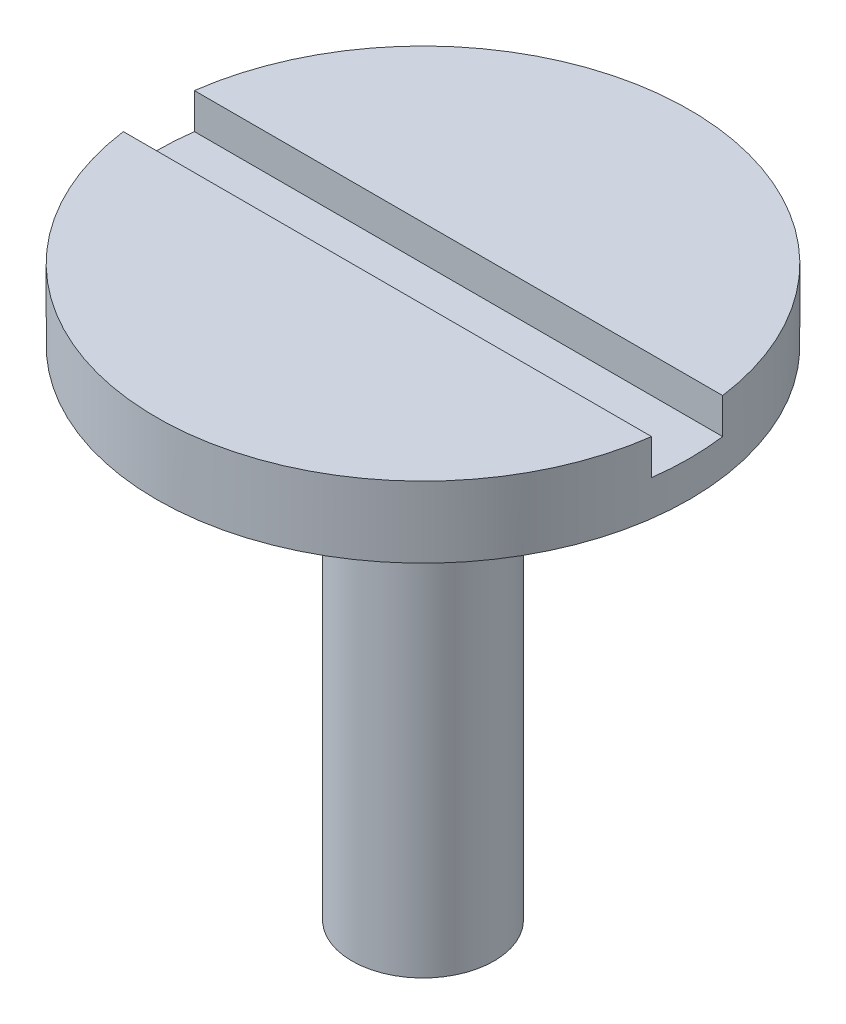
ISO-10303-21;
HEADER;
FILE_DESCRIPTION(('STEP AP214'),'2;1');
FILE_NAME('part.step','',(''),(''),'','','');
FILE_SCHEMA(('AUTOMOTIVE_DESIGN { 1 0 10303 214 1 1 1 1 }'));
ENDSEC;
DATA;
#1=APPLICATION_CONTEXT('core data for automotive mechanical design processes');
#2=APPLICATION_PROTOCOL_DEFINITION('international standard','automotive_design',2000,#1);
#3=PRODUCT_CONTEXT('',#1,'mechanical');
#4=PRODUCT('Part','Part','',(#3));
#5=PRODUCT_RELATED_PRODUCT_CATEGORY('part','',(#4));
#6=PRODUCT_DEFINITION_FORMATION('','',#4);
#7=PRODUCT_DEFINITION_CONTEXT('part definition',#1,'design');
#8=PRODUCT_DEFINITION('design','',#6,#7);
#9=PRODUCT_DEFINITION_SHAPE('','',#8);
#10=(LENGTH_UNIT() NAMED_UNIT(*) SI_UNIT(.MILLI.,.METRE.));
#11=(NAMED_UNIT(*) PLANE_ANGLE_UNIT() SI_UNIT($,.RADIAN.));
#12=(NAMED_UNIT(*) SI_UNIT($,.STERADIAN.) SOLID_ANGLE_UNIT());
#13=UNCERTAINTY_MEASURE_WITH_UNIT(LENGTH_MEASURE(1.E-05),#10,'distance_accuracy_value','');
#14=(GEOMETRIC_REPRESENTATION_CONTEXT(3) GLOBAL_UNCERTAINTY_ASSIGNED_CONTEXT((#13)) GLOBAL_UNIT_ASSIGNED_CONTEXT((#10,
#11,#12)) REPRESENTATION_CONTEXT('',''));
#15=CARTESIAN_POINT('',(0.,0.,0.));
#16=DIRECTION('',(0.,0.,1.));
#17=DIRECTION('',(1.,0.,0.));
#18=AXIS2_PLACEMENT_3D('',#15,#16,#17);
#19=CARTESIAN_POINT('',(0.,8.,0.));
#20=DIRECTION('',(0.,1.,0.));
#21=DIRECTION('',(0.,0.,1.));
#22=AXIS2_PLACEMENT_3D('',#19,#20,#21);
#23=PLANE('',#22);
#24=DIRECTION('',(-1.,0.,0.));
#25=VECTOR('',#24,1.);
#26=CARTESIAN_POINT('',(0.,8.,-0.5));
#27=LINE('',#26,#25);
#28=CARTESIAN_POINT('',(3.71651718682963,8.,-0.5));
#29=VERTEX_POINT('',#28);
#30=CARTESIAN_POINT('',(-3.71651718682963,8.,-0.5));
#31=VERTEX_POINT('',#30);
#32=EDGE_CURVE('E80',#29,#31,#27,.T.);
#33=ORIENTED_EDGE('',*,*,#32,.F.);
#34=CARTESIAN_POINT('',(0.,8.,0.));
#35=DIRECTION('',(0.,1.,0.));
#36=DIRECTION('',(0.,0.,1.));
#37=AXIS2_PLACEMENT_3D('',#34,#35,#36);
#38=CIRCLE('',#37,3.75);
#39=EDGE_CURVE('E93',#29,#31,#38,.T.);
#40=ORIENTED_EDGE('',*,*,#39,.T.);
#41=EDGE_LOOP('',(#33,#40));
#42=FACE_BOUND('',#41,.T.);
#43=ADVANCED_FACE('F33',(#42),#23,.T.);
#44=CARTESIAN_POINT('',(0.,7.,0.));
#45=DIRECTION('',(0.,-1.,0.));
#46=DIRECTION('',(0.,0.,-1.));
#47=AXIS2_PLACEMENT_3D('',#44,#45,#46);
#48=CYLINDRICAL_SURFACE('',#47,1.);
#49=CARTESIAN_POINT('',(0.,7.,0.));
#50=DIRECTION('',(0.,1.,0.));
#51=DIRECTION('',(0.,0.,1.));
#52=AXIS2_PLACEMENT_3D('',#49,#50,#51);
#53=CIRCLE('',#52,1.);
#54=CARTESIAN_POINT('',(0.,7.,1.));
#55=VERTEX_POINT('',#54);
#56=EDGE_CURVE('E81',#55,#55,#53,.T.);
#57=ORIENTED_EDGE('',*,*,#56,.F.);
#58=EDGE_LOOP('',(#57));
#59=FACE_BOUND('',#58,.T.);
#60=CARTESIAN_POINT('',(0.,0.,0.));
#61=DIRECTION('',(0.,1.,0.));
#62=DIRECTION('',(0.,0.,1.));
#63=AXIS2_PLACEMENT_3D('',#60,#61,#62);
#64=CIRCLE('',#63,1.);
#65=CARTESIAN_POINT('',(0.,0.,1.));
#66=VERTEX_POINT('',#65);
#67=EDGE_CURVE('E97',#66,#66,#64,.T.);
#68=ORIENTED_EDGE('',*,*,#67,.T.);
#69=EDGE_LOOP('',(#68));
#70=FACE_BOUND('',#69,.T.);
#71=ADVANCED_FACE('F35',(#59,#70),#48,.T.);
#72=CARTESIAN_POINT('',(0.,0.,0.));
#73=DIRECTION('',(0.,1.,0.));
#74=DIRECTION('',(0.,0.,1.));
#75=AXIS2_PLACEMENT_3D('',#72,#73,#74);
#76=PLANE('',#75);
#77=ORIENTED_EDGE('',*,*,#67,.F.);
#78=EDGE_LOOP('',(#77));
#79=FACE_BOUND('',#78,.T.);
#80=ADVANCED_FACE('F122',(#79),#76,.F.);
#81=CARTESIAN_POINT('',(0.,7.,0.));
#82=DIRECTION('',(0.,1.,0.));
#83=DIRECTION('',(0.,0.,1.));
#84=AXIS2_PLACEMENT_3D('',#81,#82,#83);
#85=PLANE('',#84);
#86=CARTESIAN_POINT('',(0.,7.,0.));
#87=DIRECTION('',(0.,1.,0.));
#88=DIRECTION('',(0.,0.,1.));
#89=AXIS2_PLACEMENT_3D('',#86,#87,#88);
#90=CIRCLE('',#89,3.75);
#91=CARTESIAN_POINT('',(0.,7.,3.75));
#92=VERTEX_POINT('',#91);
#93=EDGE_CURVE('E94',#92,#92,#90,.T.);
#94=ORIENTED_EDGE('',*,*,#93,.F.);
#95=EDGE_LOOP('',(#94));
#96=FACE_BOUND('',#95,.T.);
#97=ORIENTED_EDGE('',*,*,#56,.T.);
#98=EDGE_LOOP('',(#97));
#99=FACE_BOUND('',#98,.T.);
#100=ADVANCED_FACE('F132',(#96,#99),#85,.F.);
#101=CARTESIAN_POINT('',(0.,8.,0.));
#102=DIRECTION('',(0.,-1.,0.));
#103=DIRECTION('',(0.,0.,-1.));
#104=AXIS2_PLACEMENT_3D('',#101,#102,#103);
#105=CYLINDRICAL_SURFACE('',#104,3.75);
#106=ORIENTED_EDGE('',*,*,#39,.F.);
#107=DIRECTION('',(0.,-1.,0.));
#108=VECTOR('',#107,1.);
#109=CARTESIAN_POINT('',(3.71651718682963,8.,-0.5));
#110=LINE('',#109,#108);
#111=CARTESIAN_POINT('',(3.71651718682963,7.5,-0.5));
#112=VERTEX_POINT('',#111);
#113=EDGE_CURVE('E99',#29,#112,#110,.T.);
#114=ORIENTED_EDGE('',*,*,#113,.T.);
#115=CARTESIAN_POINT('',(0.,7.5,0.));
#116=DIRECTION('',(0.,1.,0.));
#117=DIRECTION('',(0.,0.,1.));
#118=AXIS2_PLACEMENT_3D('',#115,#116,#117);
#119=CIRCLE('',#118,3.75);
#120=CARTESIAN_POINT('',(3.71651718682963,7.5,0.5));
#121=VERTEX_POINT('',#120);
#122=EDGE_CURVE('E11',#121,#112,#119,.T.);
#123=ORIENTED_EDGE('',*,*,#122,.F.);
#124=DIRECTION('',(0.,-1.,0.));
#125=VECTOR('',#124,1.);
#126=CARTESIAN_POINT('',(3.71651718682963,8.,0.5));
#127=LINE('',#126,#125);
#128=CARTESIAN_POINT('',(3.71651718682963,8.,0.5));
#129=VERTEX_POINT('',#128);
#130=EDGE_CURVE('E75',#121,#129,#127,.F.);
#131=ORIENTED_EDGE('',*,*,#130,.T.);
#132=CARTESIAN_POINT('',(-3.71651718682963,8.,0.5));
#133=VERTEX_POINT('',#132);
#134=EDGE_CURVE('E88',#133,#129,#38,.T.);
#135=ORIENTED_EDGE('',*,*,#134,.F.);
#136=DIRECTION('',(0.,-1.,0.));
#137=VECTOR('',#136,1.);
#138=CARTESIAN_POINT('',(-3.71651718682963,8.,0.5));
#139=LINE('',#138,#137);
#140=CARTESIAN_POINT('',(-3.71651718682963,7.5,0.5));
#141=VERTEX_POINT('',#140);
#142=EDGE_CURVE('E48',#133,#141,#139,.T.);
#143=ORIENTED_EDGE('',*,*,#142,.T.);
#144=CARTESIAN_POINT('',(-3.71651718682963,7.5,-0.5));
#145=VERTEX_POINT('',#144);
#146=EDGE_CURVE('E37',#145,#141,#119,.T.);
#147=ORIENTED_EDGE('',*,*,#146,.F.);
#148=DIRECTION('',(0.,-1.,0.));
#149=VECTOR('',#148,1.);
#150=CARTESIAN_POINT('',(-3.71651718682963,8.,-0.5));
#151=LINE('',#150,#149);
#152=EDGE_CURVE('E56',#145,#31,#151,.F.);
#153=ORIENTED_EDGE('',*,*,#152,.T.);
#154=EDGE_LOOP('',(#106,#114,#123,#131,#135,#143,#147,#153));
#155=FACE_BOUND('',#154,.T.);
#156=ORIENTED_EDGE('',*,*,#93,.T.);
#157=EDGE_LOOP('',(#156));
#158=FACE_BOUND('',#157,.T.);
#159=ADVANCED_FACE('F86',(#155,#158),#105,.T.);
#160=DIRECTION('',(1.,0.,0.));
#161=VECTOR('',#160,1.);
#162=CARTESIAN_POINT('',(0.,8.,0.5));
#163=LINE('',#162,#161);
#164=EDGE_CURVE('E72',#133,#129,#163,.T.);
#165=ORIENTED_EDGE('',*,*,#164,.F.);
#166=ORIENTED_EDGE('',*,*,#134,.T.);
#167=EDGE_LOOP('',(#165,#166));
#168=FACE_BOUND('',#167,.T.);
#169=ADVANCED_FACE('F92',(#168),#23,.T.);
#170=CARTESIAN_POINT('',(-4.18940243689785,7.5,0.5));
#171=DIRECTION('',(0.,1.,0.));
#172=DIRECTION('',(0.,0.,1.));
#173=AXIS2_PLACEMENT_3D('',#170,#171,#172);
#174=PLANE('',#173);
#175=ORIENTED_EDGE('',*,*,#122,.T.);
#176=DIRECTION('',(-1.,0.,0.));
#177=VECTOR('',#176,1.);
#178=CARTESIAN_POINT('',(-4.18940243689785,7.5,-0.5));
#179=LINE('',#178,#177);
#180=EDGE_CURVE('E90',#112,#145,#179,.T.);
#181=ORIENTED_EDGE('',*,*,#180,.T.);
#182=ORIENTED_EDGE('',*,*,#146,.T.);
#183=DIRECTION('',(1.,0.,0.));
#184=VECTOR('',#183,1.);
#185=CARTESIAN_POINT('',(-4.18940243689785,7.5,0.5));
#186=LINE('',#185,#184);
#187=EDGE_CURVE('E111',#141,#121,#186,.T.);
#188=ORIENTED_EDGE('',*,*,#187,.T.);
#189=EDGE_LOOP('',(#175,#181,#182,#188));
#190=FACE_BOUND('',#189,.T.);
#191=ADVANCED_FACE('F110',(#190),#174,.T.);
#192=CARTESIAN_POINT('',(-4.18940243689785,7.5,-0.5));
#193=DIRECTION('',(0.,0.,-1.));
#194=DIRECTION('',(-1.,0.,0.));
#195=AXIS2_PLACEMENT_3D('',#192,#193,#194);
#196=PLANE('',#195);
#197=ORIENTED_EDGE('',*,*,#32,.T.);
#198=ORIENTED_EDGE('',*,*,#152,.F.);
#199=ORIENTED_EDGE('',*,*,#180,.F.);
#200=ORIENTED_EDGE('',*,*,#113,.F.);
#201=EDGE_LOOP('',(#197,#198,#199,#200));
#202=FACE_BOUND('',#201,.T.);
#203=ADVANCED_FACE('F115',(#202),#196,.F.);
#204=CARTESIAN_POINT('',(-4.18940243689785,7.5,0.5));
#205=DIRECTION('',(0.,0.,1.));
#206=DIRECTION('',(1.,0.,0.));
#207=AXIS2_PLACEMENT_3D('',#204,#205,#206);
#208=PLANE('',#207);
#209=ORIENTED_EDGE('',*,*,#164,.T.);
#210=ORIENTED_EDGE('',*,*,#130,.F.);
#211=ORIENTED_EDGE('',*,*,#187,.F.);
#212=ORIENTED_EDGE('',*,*,#142,.F.);
#213=EDGE_LOOP('',(#209,#210,#211,#212));
#214=FACE_BOUND('',#213,.T.);
#215=ADVANCED_FACE('F74',(#214),#208,.F.);
#216=CLOSED_SHELL('',(#43,#71,#80,#100,#159,#169,#191,#203,#215));
#217=MANIFOLD_SOLID_BREP('B2',#216);
#218=ADVANCED_BREP_SHAPE_REPRESENTATION('',(#18,#217),#14);
#219=SHAPE_DEFINITION_REPRESENTATION(#9,#218);
ENDSEC;
END-ISO-10303-21;
